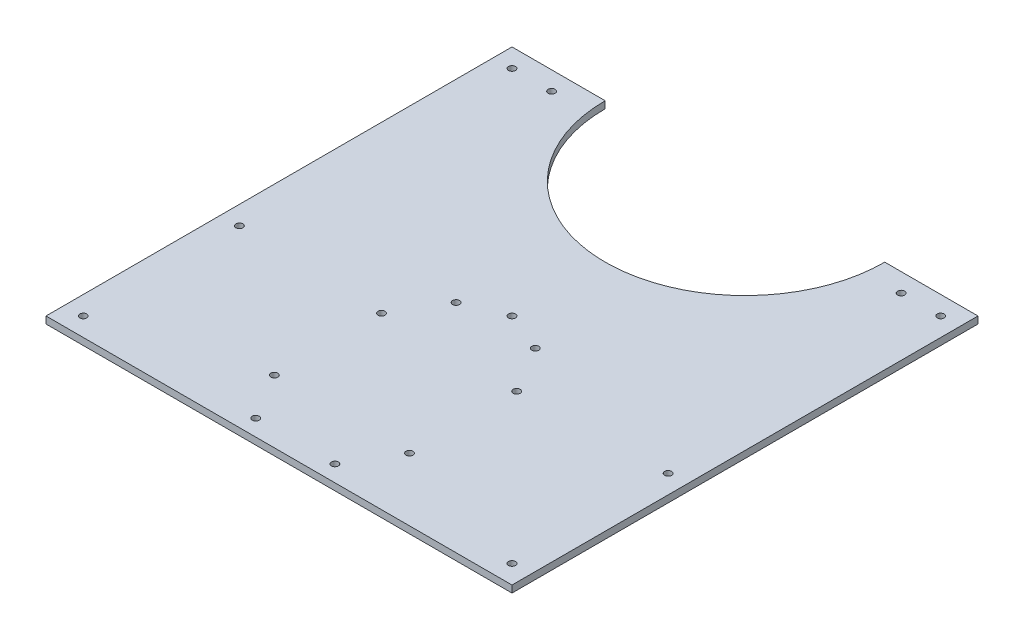
ISO-10303-21;
HEADER;
FILE_DESCRIPTION(('STEP AP214'),'2;1');
FILE_NAME('part.step','',(''),(''),'','','');
FILE_SCHEMA(('AUTOMOTIVE_DESIGN { 1 0 10303 214 1 1 1 1 }'));
ENDSEC;
DATA;
#1=APPLICATION_CONTEXT('core data for automotive mechanical design processes');
#2=APPLICATION_PROTOCOL_DEFINITION('international standard','automotive_design',2000,#1);
#3=PRODUCT_CONTEXT('',#1,'mechanical');
#4=PRODUCT('Part','Part','',(#3));
#5=PRODUCT_RELATED_PRODUCT_CATEGORY('part','',(#4));
#6=PRODUCT_DEFINITION_FORMATION('','',#4);
#7=PRODUCT_DEFINITION_CONTEXT('part definition',#1,'design');
#8=PRODUCT_DEFINITION('design','',#6,#7);
#9=PRODUCT_DEFINITION_SHAPE('','',#8);
#10=(LENGTH_UNIT() NAMED_UNIT(*) SI_UNIT(.MILLI.,.METRE.));
#11=(NAMED_UNIT(*) PLANE_ANGLE_UNIT() SI_UNIT($,.RADIAN.));
#12=(NAMED_UNIT(*) SI_UNIT($,.STERADIAN.) SOLID_ANGLE_UNIT());
#13=UNCERTAINTY_MEASURE_WITH_UNIT(LENGTH_MEASURE(1.E-05),#10,'distance_accuracy_value','');
#14=(GEOMETRIC_REPRESENTATION_CONTEXT(3) GLOBAL_UNCERTAINTY_ASSIGNED_CONTEXT((#13)) GLOBAL_UNIT_ASSIGNED_CONTEXT((#10,
#11,#12)) REPRESENTATION_CONTEXT('',''));
#15=CARTESIAN_POINT('',(0.,0.,0.));
#16=DIRECTION('',(0.,0.,1.));
#17=DIRECTION('',(1.,0.,0.));
#18=AXIS2_PLACEMENT_3D('',#15,#16,#17);
#19=CARTESIAN_POINT('',(-100.,3.,-100.));
#20=DIRECTION('',(0.,0.,1.));
#21=DIRECTION('',(1.,0.,0.));
#22=AXIS2_PLACEMENT_3D('',#19,#20,#21);
#23=PLANE('',#22);
#24=DIRECTION('',(-1.,0.,0.));
#25=VECTOR('',#24,1.);
#26=CARTESIAN_POINT('',(-100.,0.,-100.));
#27=LINE('',#26,#25);
#28=CARTESIAN_POINT('',(100.,0.,-100.));
#29=VERTEX_POINT('',#28);
#30=CARTESIAN_POINT('',(60.,0.,-100.));
#31=VERTEX_POINT('',#30);
#32=EDGE_CURVE('E108',#29,#31,#27,.T.);
#33=ORIENTED_EDGE('',*,*,#32,.T.);
#34=DIRECTION('',(0.,1.,0.));
#35=VECTOR('',#34,1.);
#36=CARTESIAN_POINT('',(60.,-2.,-100.));
#37=LINE('',#36,#35);
#38=CARTESIAN_POINT('',(60.,3.,-100.));
#39=VERTEX_POINT('',#38);
#40=EDGE_CURVE('E50',#31,#39,#37,.T.);
#41=ORIENTED_EDGE('',*,*,#40,.T.);
#42=DIRECTION('',(-1.,0.,0.));
#43=VECTOR('',#42,1.);
#44=CARTESIAN_POINT('',(-100.,3.,-100.));
#45=LINE('',#44,#43);
#46=CARTESIAN_POINT('',(100.,3.,-100.));
#47=VERTEX_POINT('',#46);
#48=EDGE_CURVE('E106',#47,#39,#45,.T.);
#49=ORIENTED_EDGE('',*,*,#48,.F.);
#50=DIRECTION('',(0.,-1.,0.));
#51=VECTOR('',#50,1.);
#52=CARTESIAN_POINT('',(100.,3.,-100.));
#53=LINE('',#52,#51);
#54=EDGE_CURVE('E118',#47,#29,#53,.T.);
#55=ORIENTED_EDGE('',*,*,#54,.T.);
#56=EDGE_LOOP('',(#33,#41,#49,#55));
#57=FACE_BOUND('',#56,.T.);
#58=ADVANCED_FACE('F33',(#57),#23,.F.);
#59=CARTESIAN_POINT('',(-100.,3.,-100.));
#60=DIRECTION('',(1.,0.,0.));
#61=DIRECTION('',(0.,0.,-1.));
#62=AXIS2_PLACEMENT_3D('',#59,#60,#61);
#63=PLANE('',#62);
#64=DIRECTION('',(0.,0.,1.));
#65=VECTOR('',#64,1.);
#66=CARTESIAN_POINT('',(-100.,0.,-100.));
#67=LINE('',#66,#65);
#68=CARTESIAN_POINT('',(-100.,0.,-100.));
#69=VERTEX_POINT('',#68);
#70=CARTESIAN_POINT('',(-100.,0.,100.));
#71=VERTEX_POINT('',#70);
#72=EDGE_CURVE('E123',#69,#71,#67,.T.);
#73=ORIENTED_EDGE('',*,*,#72,.T.);
#74=DIRECTION('',(0.,-1.,0.));
#75=VECTOR('',#74,1.);
#76=CARTESIAN_POINT('',(-100.,3.,100.));
#77=LINE('',#76,#75);
#78=CARTESIAN_POINT('',(-100.,3.,100.));
#79=VERTEX_POINT('',#78);
#80=EDGE_CURVE('E42',#79,#71,#77,.T.);
#81=ORIENTED_EDGE('',*,*,#80,.F.);
#82=DIRECTION('',(0.,0.,1.));
#83=VECTOR('',#82,1.);
#84=CARTESIAN_POINT('',(-100.,3.,-100.));
#85=LINE('',#84,#83);
#86=CARTESIAN_POINT('',(-100.,3.,-100.));
#87=VERTEX_POINT('',#86);
#88=EDGE_CURVE('E130',#87,#79,#85,.T.);
#89=ORIENTED_EDGE('',*,*,#88,.F.);
#90=DIRECTION('',(0.,-1.,0.));
#91=VECTOR('',#90,1.);
#92=CARTESIAN_POINT('',(-100.,3.,-100.));
#93=LINE('',#92,#91);
#94=EDGE_CURVE('E116',#87,#69,#93,.T.);
#95=ORIENTED_EDGE('',*,*,#94,.T.);
#96=EDGE_LOOP('',(#73,#81,#89,#95));
#97=FACE_BOUND('',#96,.T.);
#98=ADVANCED_FACE('F35',(#97),#63,.F.);
#99=CARTESIAN_POINT('',(-100.,3.,100.));
#100=DIRECTION('',(0.,0.,-1.));
#101=DIRECTION('',(-1.,0.,0.));
#102=AXIS2_PLACEMENT_3D('',#99,#100,#101);
#103=PLANE('',#102);
#104=DIRECTION('',(1.,0.,0.));
#105=VECTOR('',#104,1.);
#106=CARTESIAN_POINT('',(-100.,0.,100.));
#107=LINE('',#106,#105);
#108=CARTESIAN_POINT('',(100.,0.,100.));
#109=VERTEX_POINT('',#108);
#110=EDGE_CURVE('E126',#71,#109,#107,.T.);
#111=ORIENTED_EDGE('',*,*,#110,.T.);
#112=DIRECTION('',(0.,-1.,0.));
#113=VECTOR('',#112,1.);
#114=CARTESIAN_POINT('',(100.,3.,100.));
#115=LINE('',#114,#113);
#116=CARTESIAN_POINT('',(100.,3.,100.));
#117=VERTEX_POINT('',#116);
#118=EDGE_CURVE('E133',#117,#109,#115,.T.);
#119=ORIENTED_EDGE('',*,*,#118,.F.);
#120=DIRECTION('',(1.,0.,0.));
#121=VECTOR('',#120,1.);
#122=CARTESIAN_POINT('',(-100.,3.,100.));
#123=LINE('',#122,#121);
#124=EDGE_CURVE('E88',#79,#117,#123,.T.);
#125=ORIENTED_EDGE('',*,*,#124,.F.);
#126=ORIENTED_EDGE('',*,*,#80,.T.);
#127=EDGE_LOOP('',(#111,#119,#125,#126));
#128=FACE_BOUND('',#127,.T.);
#129=ADVANCED_FACE('F209',(#128),#103,.F.);
#130=CARTESIAN_POINT('',(100.,3.,-100.));
#131=DIRECTION('',(-1.,0.,0.));
#132=DIRECTION('',(0.,0.,1.));
#133=AXIS2_PLACEMENT_3D('',#130,#131,#132);
#134=PLANE('',#133);
#135=DIRECTION('',(0.,0.,-1.));
#136=VECTOR('',#135,1.);
#137=CARTESIAN_POINT('',(100.,0.,-100.));
#138=LINE('',#137,#136);
#139=EDGE_CURVE('E128',#109,#29,#138,.T.);
#140=ORIENTED_EDGE('',*,*,#139,.T.);
#141=ORIENTED_EDGE('',*,*,#54,.F.);
#142=DIRECTION('',(0.,0.,-1.));
#143=VECTOR('',#142,1.);
#144=CARTESIAN_POINT('',(100.,3.,-100.));
#145=LINE('',#144,#143);
#146=EDGE_CURVE('E114',#117,#47,#145,.T.);
#147=ORIENTED_EDGE('',*,*,#146,.F.);
#148=ORIENTED_EDGE('',*,*,#118,.T.);
#149=EDGE_LOOP('',(#140,#141,#147,#148));
#150=FACE_BOUND('',#149,.T.);
#151=ADVANCED_FACE('F214',(#150),#134,.F.);
#152=CARTESIAN_POINT('',(-60.,3.,-100.));
#153=VERTEX_POINT('',#152);
#154=EDGE_CURVE('E58',#153,#87,#45,.T.);
#155=ORIENTED_EDGE('',*,*,#154,.F.);
#156=DIRECTION('',(0.,1.,0.));
#157=VECTOR('',#156,1.);
#158=CARTESIAN_POINT('',(-60.,-2.,-100.));
#159=LINE('',#158,#157);
#160=CARTESIAN_POINT('',(-60.,0.,-100.));
#161=VERTEX_POINT('',#160);
#162=EDGE_CURVE('E97',#153,#161,#159,.F.);
#163=ORIENTED_EDGE('',*,*,#162,.T.);
#164=EDGE_CURVE('E80',#161,#69,#27,.T.);
#165=ORIENTED_EDGE('',*,*,#164,.T.);
#166=ORIENTED_EDGE('',*,*,#94,.F.);
#167=EDGE_LOOP('',(#155,#163,#165,#166));
#168=FACE_BOUND('',#167,.T.);
#169=ADVANCED_FACE('F205',(#168),#23,.F.);
#170=CARTESIAN_POINT('',(0.,3.,0.));
#171=DIRECTION('',(0.,1.,0.));
#172=DIRECTION('',(0.,0.,1.));
#173=AXIS2_PLACEMENT_3D('',#170,#171,#172);
#174=PLANE('',#173);
#175=CARTESIAN_POINT('',(29.,3.,27.));
#176=DIRECTION('',(0.,1.,0.));
#177=DIRECTION('',(0.,0.,-1.));
#178=AXIS2_PLACEMENT_3D('',#175,#176,#177);
#179=CIRCLE('',#178,1.50000000000001);
#180=CARTESIAN_POINT('',(29.,3.,25.5));
#181=VERTEX_POINT('',#180);
#182=EDGE_CURVE('E247',#181,#181,#179,.T.);
#183=ORIENTED_EDGE('',*,*,#182,.F.);
#184=EDGE_LOOP('',(#183));
#185=FACE_BOUND('',#184,.T.);
#186=CARTESIAN_POINT('',(17.,3.,6.99999999999999));
#187=DIRECTION('',(0.,1.,0.));
#188=DIRECTION('',(0.,0.,-1.));
#189=AXIS2_PLACEMENT_3D('',#186,#187,#188);
#190=CIRCLE('',#189,1.5);
#191=CARTESIAN_POINT('',(17.,3.,5.49999999999999));
#192=VERTEX_POINT('',#191);
#193=EDGE_CURVE('E262',#192,#192,#190,.T.);
#194=ORIENTED_EDGE('',*,*,#193,.F.);
#195=EDGE_LOOP('',(#194));
#196=FACE_BOUND('',#195,.T.);
#197=CARTESIAN_POINT('',(-92.0000000000001,3.,25.));
#198=DIRECTION('',(0.,1.,0.));
#199=DIRECTION('',(0.,0.,-1.));
#200=AXIS2_PLACEMENT_3D('',#197,#198,#199);
#201=CIRCLE('',#200,1.50000000000001);
#202=CARTESIAN_POINT('',(-92.0000000000001,3.,23.5));
#203=VERTEX_POINT('',#202);
#204=EDGE_CURVE('E258',#203,#203,#201,.T.);
#205=ORIENTED_EDGE('',*,*,#204,.F.);
#206=EDGE_LOOP('',(#205));
#207=FACE_BOUND('',#206,.T.);
#208=CARTESIAN_POINT('',(-17.0000000000001,3.,93.));
#209=DIRECTION('',(0.,1.,0.));
#210=DIRECTION('',(0.,0.,-1.));
#211=AXIS2_PLACEMENT_3D('',#208,#209,#210);
#212=CIRCLE('',#211,1.5);
#213=CARTESIAN_POINT('',(-17.0000000000001,3.,91.5));
#214=VERTEX_POINT('',#213);
#215=EDGE_CURVE('E255',#214,#214,#212,.T.);
#216=ORIENTED_EDGE('',*,*,#215,.F.);
#217=EDGE_LOOP('',(#216));
#218=FACE_BOUND('',#217,.T.);
#219=CARTESIAN_POINT('',(-29.0000000000001,3.,73.));
#220=DIRECTION('',(0.,1.,0.));
#221=DIRECTION('',(0.,0.,-1.));
#222=AXIS2_PLACEMENT_3D('',#219,#220,#221);
#223=CIRCLE('',#222,1.50000000000001);
#224=CARTESIAN_POINT('',(-29.0000000000001,3.,71.5));
#225=VERTEX_POINT('',#224);
#226=EDGE_CURVE('E259',#225,#225,#223,.T.);
#227=ORIENTED_EDGE('',*,*,#226,.F.);
#228=EDGE_LOOP('',(#227));
#229=FACE_BOUND('',#228,.T.);
#230=CARTESIAN_POINT('',(-29.0000000000001,3.,27.));
#231=DIRECTION('',(0.,1.,0.));
#232=DIRECTION('',(0.,0.,1.));
#233=AXIS2_PLACEMENT_3D('',#230,#231,#232);
#234=CIRCLE('',#233,1.50000000000001);
#235=CARTESIAN_POINT('',(-29.0000000000001,3.,28.5));
#236=VERTEX_POINT('',#235);
#237=EDGE_CURVE('E268',#236,#236,#234,.T.);
#238=ORIENTED_EDGE('',*,*,#237,.F.);
#239=EDGE_LOOP('',(#238));
#240=FACE_BOUND('',#239,.T.);
#241=CARTESIAN_POINT('',(-17.0000000000001,3.,6.99999999999999));
#242=DIRECTION('',(0.,1.,0.));
#243=DIRECTION('',(0.,0.,1.));
#244=AXIS2_PLACEMENT_3D('',#241,#242,#243);
#245=CIRCLE('',#244,1.5);
#246=CARTESIAN_POINT('',(-17.0000000000001,3.,8.49999999999999));
#247=VERTEX_POINT('',#246);
#248=EDGE_CURVE('E99',#247,#247,#245,.T.);
#249=ORIENTED_EDGE('',*,*,#248,.F.);
#250=EDGE_LOOP('',(#249));
#251=FACE_BOUND('',#250,.T.);
#252=CARTESIAN_POINT('',(0.,3.,-100.));
#253=DIRECTION('',(0.,1.,0.));
#254=DIRECTION('',(0.,0.,1.));
#255=AXIS2_PLACEMENT_3D('',#252,#253,#254);
#256=CIRCLE('',#255,60.);
#257=EDGE_CURVE('E95',#153,#39,#256,.T.);
#258=ORIENTED_EDGE('',*,*,#257,.F.);
#259=ORIENTED_EDGE('',*,*,#154,.T.);
#260=ORIENTED_EDGE('',*,*,#88,.T.);
#261=ORIENTED_EDGE('',*,*,#124,.T.);
#262=ORIENTED_EDGE('',*,*,#146,.T.);
#263=ORIENTED_EDGE('',*,*,#48,.T.);
#264=EDGE_LOOP('',(#258,#259,#260,#261,#262,#263));
#265=FACE_BOUND('',#264,.T.);
#266=CARTESIAN_POINT('',(92.,3.,25.));
#267=DIRECTION('',(0.,1.,0.));
#268=DIRECTION('',(0.,0.,1.));
#269=AXIS2_PLACEMENT_3D('',#266,#267,#268);
#270=CIRCLE('',#269,1.50000000000001);
#271=CARTESIAN_POINT('',(92.,3.,26.5));
#272=VERTEX_POINT('',#271);
#273=EDGE_CURVE('E230',#272,#272,#270,.T.);
#274=ORIENTED_EDGE('',*,*,#273,.F.);
#275=EDGE_LOOP('',(#274));
#276=FACE_BOUND('',#275,.T.);
#277=CARTESIAN_POINT('',(92.000000000005,3.,92.));
#278=DIRECTION('',(0.,1.,0.));
#279=DIRECTION('',(0.,0.,1.));
#280=AXIS2_PLACEMENT_3D('',#277,#278,#279);
#281=CIRCLE('',#280,1.49999999999874);
#282=CARTESIAN_POINT('',(92.000000000005,3.,93.4999999999987));
#283=VERTEX_POINT('',#282);
#284=EDGE_CURVE('E238',#283,#283,#281,.T.);
#285=ORIENTED_EDGE('',*,*,#284,.F.);
#286=EDGE_LOOP('',(#285));
#287=FACE_BOUND('',#286,.T.);
#288=CARTESIAN_POINT('',(-91.9999999999949,3.,92.000000000005));
#289=DIRECTION('',(0.,1.,0.));
#290=DIRECTION('',(0.,0.,1.));
#291=AXIS2_PLACEMENT_3D('',#288,#289,#290);
#292=CIRCLE('',#291,1.50000000000378);
#293=CARTESIAN_POINT('',(-91.9999999999949,3.,93.5000000000088));
#294=VERTEX_POINT('',#293);
#295=EDGE_CURVE('E234',#294,#294,#292,.T.);
#296=ORIENTED_EDGE('',*,*,#295,.F.);
#297=EDGE_LOOP('',(#296));
#298=FACE_BOUND('',#297,.T.);
#299=CARTESIAN_POINT('',(-92.,3.,-91.9999999999949));
#300=DIRECTION('',(0.,1.,0.));
#301=DIRECTION('',(0.,0.,1.));
#302=AXIS2_PLACEMENT_3D('',#299,#300,#301);
#303=CIRCLE('',#302,1.50000000000546);
#304=CARTESIAN_POINT('',(-92.,3.,-90.4999999999895));
#305=VERTEX_POINT('',#304);
#306=EDGE_CURVE('E231',#305,#305,#303,.T.);
#307=ORIENTED_EDGE('',*,*,#306,.F.);
#308=EDGE_LOOP('',(#307));
#309=FACE_BOUND('',#308,.T.);
#310=CARTESIAN_POINT('',(17.,3.,93.));
#311=DIRECTION('',(0.,1.,0.));
#312=DIRECTION('',(0.,0.,1.));
#313=AXIS2_PLACEMENT_3D('',#310,#311,#312);
#314=CIRCLE('',#313,1.5);
#315=CARTESIAN_POINT('',(17.,3.,94.5));
#316=VERTEX_POINT('',#315);
#317=EDGE_CURVE('E235',#316,#316,#314,.T.);
#318=ORIENTED_EDGE('',*,*,#317,.F.);
#319=EDGE_LOOP('',(#318));
#320=FACE_BOUND('',#319,.T.);
#321=CARTESIAN_POINT('',(29.,3.,73.));
#322=DIRECTION('',(0.,1.,0.));
#323=DIRECTION('',(0.,0.,1.));
#324=AXIS2_PLACEMENT_3D('',#321,#322,#323);
#325=CIRCLE('',#324,1.50000000000001);
#326=CARTESIAN_POINT('',(29.,3.,74.5));
#327=VERTEX_POINT('',#326);
#328=EDGE_CURVE('E250',#327,#327,#325,.T.);
#329=ORIENTED_EDGE('',*,*,#328,.F.);
#330=EDGE_LOOP('',(#329));
#331=FACE_BOUND('',#330,.T.);
#332=CARTESIAN_POINT('',(75.,3.,-92.));
#333=DIRECTION('',(0.,1.,0.));
#334=DIRECTION('',(0.,0.,1.));
#335=AXIS2_PLACEMENT_3D('',#332,#333,#334);
#336=CIRCLE('',#335,1.50000000000001);
#337=CARTESIAN_POINT('',(75.,3.,-90.5));
#338=VERTEX_POINT('',#337);
#339=EDGE_CURVE('E246',#338,#338,#336,.T.);
#340=ORIENTED_EDGE('',*,*,#339,.F.);
#341=EDGE_LOOP('',(#340));
#342=FACE_BOUND('',#341,.T.);
#343=CARTESIAN_POINT('',(0.,3.,0.));
#344=DIRECTION('',(0.,1.,0.));
#345=DIRECTION('',(0.,0.,1.));
#346=AXIS2_PLACEMENT_3D('',#343,#344,#345);
#347=CIRCLE('',#346,1.5);
#348=CARTESIAN_POINT('',(0.,3.,1.50000000000001));
#349=VERTEX_POINT('',#348);
#350=EDGE_CURVE('E243',#349,#349,#347,.T.);
#351=ORIENTED_EDGE('',*,*,#350,.F.);
#352=EDGE_LOOP('',(#351));
#353=FACE_BOUND('',#352,.T.);
#354=CARTESIAN_POINT('',(-75.0000000000001,3.,-92.));
#355=DIRECTION('',(0.,1.,0.));
#356=DIRECTION('',(0.,0.,-1.));
#357=AXIS2_PLACEMENT_3D('',#354,#355,#356);
#358=CIRCLE('',#357,1.50000000000001);
#359=CARTESIAN_POINT('',(-75.0000000000001,3.,-93.5));
#360=VERTEX_POINT('',#359);
#361=EDGE_CURVE('E100',#360,#360,#358,.T.);
#362=ORIENTED_EDGE('',*,*,#361,.F.);
#363=EDGE_LOOP('',(#362));
#364=FACE_BOUND('',#363,.T.);
#365=CARTESIAN_POINT('',(92.,3.,-92.));
#366=DIRECTION('',(0.,1.,0.));
#367=DIRECTION('',(0.,0.,1.));
#368=AXIS2_PLACEMENT_3D('',#365,#366,#367);
#369=CIRCLE('',#368,1.5);
#370=CARTESIAN_POINT('',(92.,3.,-90.5));
#371=VERTEX_POINT('',#370);
#372=EDGE_CURVE('E141',#371,#371,#369,.T.);
#373=ORIENTED_EDGE('',*,*,#372,.F.);
#374=EDGE_LOOP('',(#373));
#375=FACE_BOUND('',#374,.T.);
#376=ADVANCED_FACE('F111',(#185,#196,#207,#218,#229,#240,#251,#265,#276,#287,#298,#309,#320,
#331,#342,#353,#364,#375),#174,.T.);
#377=CARTESIAN_POINT('',(0.,0.,0.));
#378=DIRECTION('',(0.,1.,0.));
#379=DIRECTION('',(0.,0.,1.));
#380=AXIS2_PLACEMENT_3D('',#377,#378,#379);
#381=PLANE('',#380);
#382=CARTESIAN_POINT('',(29.,0.,27.));
#383=DIRECTION('',(0.,1.,0.));
#384=DIRECTION('',(0.,0.,1.));
#385=AXIS2_PLACEMENT_3D('',#382,#383,#384);
#386=CIRCLE('',#385,1.50000000000001);
#387=CARTESIAN_POINT('',(29.,0.,28.5));
#388=VERTEX_POINT('',#387);
#389=EDGE_CURVE('E37',#388,#388,#386,.T.);
#390=ORIENTED_EDGE('',*,*,#389,.T.);
#391=EDGE_LOOP('',(#390));
#392=FACE_BOUND('',#391,.T.);
#393=CARTESIAN_POINT('',(17.,0.,6.99999999999999));
#394=DIRECTION('',(0.,1.,0.));
#395=DIRECTION('',(0.,0.,1.));
#396=AXIS2_PLACEMENT_3D('',#393,#394,#395);
#397=CIRCLE('',#396,1.5);
#398=CARTESIAN_POINT('',(17.,0.,8.49999999999999));
#399=VERTEX_POINT('',#398);
#400=EDGE_CURVE('E181',#399,#399,#397,.T.);
#401=ORIENTED_EDGE('',*,*,#400,.T.);
#402=EDGE_LOOP('',(#401));
#403=FACE_BOUND('',#402,.T.);
#404=CARTESIAN_POINT('',(-92.0000000000001,0.,25.));
#405=DIRECTION('',(0.,1.,0.));
#406=DIRECTION('',(0.,0.,1.));
#407=AXIS2_PLACEMENT_3D('',#404,#405,#406);
#408=CIRCLE('',#407,1.50000000000001);
#409=CARTESIAN_POINT('',(-92.0000000000001,0.,26.5));
#410=VERTEX_POINT('',#409);
#411=EDGE_CURVE('E179',#410,#410,#408,.T.);
#412=ORIENTED_EDGE('',*,*,#411,.T.);
#413=EDGE_LOOP('',(#412));
#414=FACE_BOUND('',#413,.T.);
#415=CARTESIAN_POINT('',(-17.0000000000001,0.,93.));
#416=DIRECTION('',(0.,1.,0.));
#417=DIRECTION('',(0.,0.,1.));
#418=AXIS2_PLACEMENT_3D('',#415,#416,#417);
#419=CIRCLE('',#418,1.5);
#420=CARTESIAN_POINT('',(-17.0000000000001,0.,94.5));
#421=VERTEX_POINT('',#420);
#422=EDGE_CURVE('E176',#421,#421,#419,.T.);
#423=ORIENTED_EDGE('',*,*,#422,.T.);
#424=EDGE_LOOP('',(#423));
#425=FACE_BOUND('',#424,.T.);
#426=CARTESIAN_POINT('',(-29.0000000000001,0.,73.));
#427=DIRECTION('',(0.,1.,0.));
#428=DIRECTION('',(0.,0.,1.));
#429=AXIS2_PLACEMENT_3D('',#426,#427,#428);
#430=CIRCLE('',#429,1.50000000000001);
#431=CARTESIAN_POINT('',(-29.0000000000001,0.,74.5));
#432=VERTEX_POINT('',#431);
#433=EDGE_CURVE('E173',#432,#432,#430,.T.);
#434=ORIENTED_EDGE('',*,*,#433,.T.);
#435=EDGE_LOOP('',(#434));
#436=FACE_BOUND('',#435,.T.);
#437=CARTESIAN_POINT('',(-29.0000000000001,0.,27.));
#438=DIRECTION('',(0.,1.,0.));
#439=DIRECTION('',(0.,0.,1.));
#440=AXIS2_PLACEMENT_3D('',#437,#438,#439);
#441=CIRCLE('',#440,1.50000000000001);
#442=CARTESIAN_POINT('',(-29.0000000000001,0.,28.5));
#443=VERTEX_POINT('',#442);
#444=EDGE_CURVE('E170',#443,#443,#441,.T.);
#445=ORIENTED_EDGE('',*,*,#444,.T.);
#446=EDGE_LOOP('',(#445));
#447=FACE_BOUND('',#446,.T.);
#448=CARTESIAN_POINT('',(-17.0000000000001,0.,6.99999999999999));
#449=DIRECTION('',(0.,1.,0.));
#450=DIRECTION('',(0.,0.,1.));
#451=AXIS2_PLACEMENT_3D('',#448,#449,#450);
#452=CIRCLE('',#451,1.5);
#453=CARTESIAN_POINT('',(-17.0000000000001,0.,8.49999999999999));
#454=VERTEX_POINT('',#453);
#455=EDGE_CURVE('E109',#454,#454,#452,.T.);
#456=ORIENTED_EDGE('',*,*,#455,.T.);
#457=EDGE_LOOP('',(#456));
#458=FACE_BOUND('',#457,.T.);
#459=CARTESIAN_POINT('',(92.,0.,25.));
#460=DIRECTION('',(0.,1.,0.));
#461=DIRECTION('',(0.,0.,1.));
#462=AXIS2_PLACEMENT_3D('',#459,#460,#461);
#463=CIRCLE('',#462,1.50000000000001);
#464=CARTESIAN_POINT('',(92.,0.,26.5));
#465=VERTEX_POINT('',#464);
#466=EDGE_CURVE('E165',#465,#465,#463,.T.);
#467=ORIENTED_EDGE('',*,*,#466,.T.);
#468=EDGE_LOOP('',(#467));
#469=FACE_BOUND('',#468,.T.);
#470=CARTESIAN_POINT('',(92.000000000005,0.,92.));
#471=DIRECTION('',(0.,1.,0.));
#472=DIRECTION('',(0.,0.,1.));
#473=AXIS2_PLACEMENT_3D('',#470,#471,#472);
#474=CIRCLE('',#473,1.49999999999874);
#475=CARTESIAN_POINT('',(92.000000000005,0.,93.4999999999987));
#476=VERTEX_POINT('',#475);
#477=EDGE_CURVE('E162',#476,#476,#474,.T.);
#478=ORIENTED_EDGE('',*,*,#477,.T.);
#479=EDGE_LOOP('',(#478));
#480=FACE_BOUND('',#479,.T.);
#481=CARTESIAN_POINT('',(-91.9999999999949,0.,92.000000000005));
#482=DIRECTION('',(0.,1.,0.));
#483=DIRECTION('',(0.,0.,1.));
#484=AXIS2_PLACEMENT_3D('',#481,#482,#483);
#485=CIRCLE('',#484,1.50000000000378);
#486=CARTESIAN_POINT('',(-91.9999999999949,0.,93.5000000000088));
#487=VERTEX_POINT('',#486);
#488=EDGE_CURVE('E159',#487,#487,#485,.T.);
#489=ORIENTED_EDGE('',*,*,#488,.T.);
#490=EDGE_LOOP('',(#489));
#491=FACE_BOUND('',#490,.T.);
#492=CARTESIAN_POINT('',(-92.,0.,-91.9999999999949));
#493=DIRECTION('',(0.,1.,0.));
#494=DIRECTION('',(0.,0.,1.));
#495=AXIS2_PLACEMENT_3D('',#492,#493,#494);
#496=CIRCLE('',#495,1.50000000000546);
#497=CARTESIAN_POINT('',(-92.,0.,-90.4999999999895));
#498=VERTEX_POINT('',#497);
#499=EDGE_CURVE('E156',#498,#498,#496,.T.);
#500=ORIENTED_EDGE('',*,*,#499,.T.);
#501=EDGE_LOOP('',(#500));
#502=FACE_BOUND('',#501,.T.);
#503=CARTESIAN_POINT('',(17.,0.,93.));
#504=DIRECTION('',(0.,1.,0.));
#505=DIRECTION('',(0.,0.,1.));
#506=AXIS2_PLACEMENT_3D('',#503,#504,#505);
#507=CIRCLE('',#506,1.5);
#508=CARTESIAN_POINT('',(17.,0.,94.5));
#509=VERTEX_POINT('',#508);
#510=EDGE_CURVE('E153',#509,#509,#507,.T.);
#511=ORIENTED_EDGE('',*,*,#510,.T.);
#512=EDGE_LOOP('',(#511));
#513=FACE_BOUND('',#512,.T.);
#514=CARTESIAN_POINT('',(29.,0.,73.));
#515=DIRECTION('',(0.,1.,0.));
#516=DIRECTION('',(0.,0.,1.));
#517=AXIS2_PLACEMENT_3D('',#514,#515,#516);
#518=CIRCLE('',#517,1.50000000000001);
#519=CARTESIAN_POINT('',(29.,0.,74.5));
#520=VERTEX_POINT('',#519);
#521=EDGE_CURVE('E150',#520,#520,#518,.T.);
#522=ORIENTED_EDGE('',*,*,#521,.T.);
#523=EDGE_LOOP('',(#522));
#524=FACE_BOUND('',#523,.T.);
#525=CARTESIAN_POINT('',(75.,0.,-92.));
#526=DIRECTION('',(0.,1.,0.));
#527=DIRECTION('',(0.,0.,1.));
#528=AXIS2_PLACEMENT_3D('',#525,#526,#527);
#529=CIRCLE('',#528,1.50000000000001);
#530=CARTESIAN_POINT('',(75.,0.,-90.5));
#531=VERTEX_POINT('',#530);
#532=EDGE_CURVE('E147',#531,#531,#529,.T.);
#533=ORIENTED_EDGE('',*,*,#532,.T.);
#534=EDGE_LOOP('',(#533));
#535=FACE_BOUND('',#534,.T.);
#536=CARTESIAN_POINT('',(0.,0.,0.));
#537=DIRECTION('',(0.,1.,0.));
#538=DIRECTION('',(0.,0.,1.));
#539=AXIS2_PLACEMENT_3D('',#536,#537,#538);
#540=CIRCLE('',#539,1.5);
#541=CARTESIAN_POINT('',(0.,0.,1.50000000000001));
#542=VERTEX_POINT('',#541);
#543=EDGE_CURVE('E144',#542,#542,#540,.T.);
#544=ORIENTED_EDGE('',*,*,#543,.T.);
#545=EDGE_LOOP('',(#544));
#546=FACE_BOUND('',#545,.T.);
#547=CARTESIAN_POINT('',(-75.0000000000001,0.,-92.));
#548=DIRECTION('',(0.,1.,0.));
#549=DIRECTION('',(0.,0.,1.));
#550=AXIS2_PLACEMENT_3D('',#547,#548,#549);
#551=CIRCLE('',#550,1.50000000000001);
#552=CARTESIAN_POINT('',(-75.0000000000001,0.,-90.5));
#553=VERTEX_POINT('',#552);
#554=EDGE_CURVE('E140',#553,#553,#551,.T.);
#555=ORIENTED_EDGE('',*,*,#554,.T.);
#556=EDGE_LOOP('',(#555));
#557=FACE_BOUND('',#556,.T.);
#558=CARTESIAN_POINT('',(92.,0.,-92.));
#559=DIRECTION('',(0.,1.,0.));
#560=DIRECTION('',(0.,0.,1.));
#561=AXIS2_PLACEMENT_3D('',#558,#559,#560);
#562=CIRCLE('',#561,1.5);
#563=CARTESIAN_POINT('',(92.,0.,-90.5));
#564=VERTEX_POINT('',#563);
#565=EDGE_CURVE('E137',#564,#564,#562,.T.);
#566=ORIENTED_EDGE('',*,*,#565,.T.);
#567=EDGE_LOOP('',(#566));
#568=FACE_BOUND('',#567,.T.);
#569=ORIENTED_EDGE('',*,*,#164,.F.);
#570=CARTESIAN_POINT('',(0.,0.,-100.));
#571=DIRECTION('',(0.,1.,0.));
#572=DIRECTION('',(0.,0.,1.));
#573=AXIS2_PLACEMENT_3D('',#570,#571,#572);
#574=CIRCLE('',#573,60.);
#575=EDGE_CURVE('E11',#161,#31,#574,.T.);
#576=ORIENTED_EDGE('',*,*,#575,.T.);
#577=ORIENTED_EDGE('',*,*,#32,.F.);
#578=ORIENTED_EDGE('',*,*,#139,.F.);
#579=ORIENTED_EDGE('',*,*,#110,.F.);
#580=ORIENTED_EDGE('',*,*,#72,.F.);
#581=EDGE_LOOP('',(#569,#576,#577,#578,#579,#580));
#582=FACE_BOUND('',#581,.T.);
#583=ADVANCED_FACE('F188',(#392,#403,#414,#425,#436,#447,#458,#469,#480,#491,#502,#513,#524,
#535,#546,#557,#568,#582),#381,.F.);
#584=CARTESIAN_POINT('',(92.,-2.,-92.));
#585=DIRECTION('',(0.,1.,0.));
#586=DIRECTION('',(0.,0.,1.));
#587=AXIS2_PLACEMENT_3D('',#584,#585,#586);
#588=CYLINDRICAL_SURFACE('',#587,1.5);
#589=ORIENTED_EDGE('',*,*,#372,.T.);
#590=EDGE_LOOP('',(#589));
#591=FACE_BOUND('',#590,.T.);
#592=ORIENTED_EDGE('',*,*,#565,.F.);
#593=EDGE_LOOP('',(#592));
#594=FACE_BOUND('',#593,.T.);
#595=ADVANCED_FACE('F282',(#591,#594),#588,.F.);
#596=CARTESIAN_POINT('',(-75.0000000000001,-2.,-92.));
#597=DIRECTION('',(0.,1.,0.));
#598=DIRECTION('',(0.,0.,1.));
#599=AXIS2_PLACEMENT_3D('',#596,#597,#598);
#600=CYLINDRICAL_SURFACE('',#599,1.50000000000001);
#601=ORIENTED_EDGE('',*,*,#361,.T.);
#602=EDGE_LOOP('',(#601));
#603=FACE_BOUND('',#602,.T.);
#604=ORIENTED_EDGE('',*,*,#554,.F.);
#605=EDGE_LOOP('',(#604));
#606=FACE_BOUND('',#605,.T.);
#607=ADVANCED_FACE('F276',(#603,#606),#600,.F.);
#608=CARTESIAN_POINT('',(0.,-2.,0.));
#609=DIRECTION('',(0.,1.,0.));
#610=DIRECTION('',(0.,0.,1.));
#611=AXIS2_PLACEMENT_3D('',#608,#609,#610);
#612=CYLINDRICAL_SURFACE('',#611,1.5);
#613=ORIENTED_EDGE('',*,*,#350,.T.);
#614=EDGE_LOOP('',(#613));
#615=FACE_BOUND('',#614,.T.);
#616=ORIENTED_EDGE('',*,*,#543,.F.);
#617=EDGE_LOOP('',(#616));
#618=FACE_BOUND('',#617,.T.);
#619=ADVANCED_FACE('F335',(#615,#618),#612,.F.);
#620=CARTESIAN_POINT('',(75.,-2.,-92.));
#621=DIRECTION('',(0.,1.,0.));
#622=DIRECTION('',(0.,0.,1.));
#623=AXIS2_PLACEMENT_3D('',#620,#621,#622);
#624=CYLINDRICAL_SURFACE('',#623,1.50000000000001);
#625=ORIENTED_EDGE('',*,*,#339,.T.);
#626=EDGE_LOOP('',(#625));
#627=FACE_BOUND('',#626,.T.);
#628=ORIENTED_EDGE('',*,*,#532,.F.);
#629=EDGE_LOOP('',(#628));
#630=FACE_BOUND('',#629,.T.);
#631=ADVANCED_FACE('F344',(#627,#630),#624,.F.);
#632=CARTESIAN_POINT('',(29.,-2.,73.));
#633=DIRECTION('',(0.,1.,0.));
#634=DIRECTION('',(0.,0.,1.));
#635=AXIS2_PLACEMENT_3D('',#632,#633,#634);
#636=CYLINDRICAL_SURFACE('',#635,1.50000000000001);
#637=ORIENTED_EDGE('',*,*,#328,.T.);
#638=EDGE_LOOP('',(#637));
#639=FACE_BOUND('',#638,.T.);
#640=ORIENTED_EDGE('',*,*,#521,.F.);
#641=EDGE_LOOP('',(#640));
#642=FACE_BOUND('',#641,.T.);
#643=ADVANCED_FACE('F354',(#639,#642),#636,.F.);
#644=CARTESIAN_POINT('',(17.,-2.,93.));
#645=DIRECTION('',(0.,1.,0.));
#646=DIRECTION('',(0.,0.,1.));
#647=AXIS2_PLACEMENT_3D('',#644,#645,#646);
#648=CYLINDRICAL_SURFACE('',#647,1.5);
#649=ORIENTED_EDGE('',*,*,#317,.T.);
#650=EDGE_LOOP('',(#649));
#651=FACE_BOUND('',#650,.T.);
#652=ORIENTED_EDGE('',*,*,#510,.F.);
#653=EDGE_LOOP('',(#652));
#654=FACE_BOUND('',#653,.T.);
#655=ADVANCED_FACE('F364',(#651,#654),#648,.F.);
#656=CARTESIAN_POINT('',(-92.,-2.,-91.9999999999949));
#657=DIRECTION('',(0.,1.,0.));
#658=DIRECTION('',(0.,0.,1.));
#659=AXIS2_PLACEMENT_3D('',#656,#657,#658);
#660=CYLINDRICAL_SURFACE('',#659,1.50000000000546);
#661=ORIENTED_EDGE('',*,*,#306,.T.);
#662=EDGE_LOOP('',(#661));
#663=FACE_BOUND('',#662,.T.);
#664=ORIENTED_EDGE('',*,*,#499,.F.);
#665=EDGE_LOOP('',(#664));
#666=FACE_BOUND('',#665,.T.);
#667=ADVANCED_FACE('F374',(#663,#666),#660,.F.);
#668=CARTESIAN_POINT('',(-91.9999999999949,-2.,92.000000000005));
#669=DIRECTION('',(0.,1.,0.));
#670=DIRECTION('',(0.,0.,1.));
#671=AXIS2_PLACEMENT_3D('',#668,#669,#670);
#672=CYLINDRICAL_SURFACE('',#671,1.50000000000378);
#673=ORIENTED_EDGE('',*,*,#295,.T.);
#674=EDGE_LOOP('',(#673));
#675=FACE_BOUND('',#674,.T.);
#676=ORIENTED_EDGE('',*,*,#488,.F.);
#677=EDGE_LOOP('',(#676));
#678=FACE_BOUND('',#677,.T.);
#679=ADVANCED_FACE('F384',(#675,#678),#672,.F.);
#680=CARTESIAN_POINT('',(92.000000000005,-2.,92.));
#681=DIRECTION('',(0.,1.,0.));
#682=DIRECTION('',(0.,0.,1.));
#683=AXIS2_PLACEMENT_3D('',#680,#681,#682);
#684=CYLINDRICAL_SURFACE('',#683,1.49999999999874);
#685=ORIENTED_EDGE('',*,*,#284,.T.);
#686=EDGE_LOOP('',(#685));
#687=FACE_BOUND('',#686,.T.);
#688=ORIENTED_EDGE('',*,*,#477,.F.);
#689=EDGE_LOOP('',(#688));
#690=FACE_BOUND('',#689,.T.);
#691=ADVANCED_FACE('F394',(#687,#690),#684,.F.);
#692=CARTESIAN_POINT('',(92.,-2.,25.));
#693=DIRECTION('',(0.,1.,0.));
#694=DIRECTION('',(0.,0.,1.));
#695=AXIS2_PLACEMENT_3D('',#692,#693,#694);
#696=CYLINDRICAL_SURFACE('',#695,1.50000000000001);
#697=ORIENTED_EDGE('',*,*,#273,.T.);
#698=EDGE_LOOP('',(#697));
#699=FACE_BOUND('',#698,.T.);
#700=ORIENTED_EDGE('',*,*,#466,.F.);
#701=EDGE_LOOP('',(#700));
#702=FACE_BOUND('',#701,.T.);
#703=ADVANCED_FACE('F404',(#699,#702),#696,.F.);
#704=CARTESIAN_POINT('',(0.,-2.,-100.));
#705=DIRECTION('',(0.,1.,0.));
#706=DIRECTION('',(0.,0.,1.));
#707=AXIS2_PLACEMENT_3D('',#704,#705,#706);
#708=CYLINDRICAL_SURFACE('',#707,60.);
#709=ORIENTED_EDGE('',*,*,#575,.F.);
#710=ORIENTED_EDGE('',*,*,#162,.F.);
#711=ORIENTED_EDGE('',*,*,#257,.T.);
#712=ORIENTED_EDGE('',*,*,#40,.F.);
#713=EDGE_LOOP('',(#709,#710,#711,#712));
#714=FACE_BOUND('',#713,.T.);
#715=ADVANCED_FACE('F96',(#714),#708,.F.);
#716=CARTESIAN_POINT('',(-17.0000000000001,-2.,6.99999999999999));
#717=DIRECTION('',(0.,1.,0.));
#718=DIRECTION('',(0.,0.,1.));
#719=AXIS2_PLACEMENT_3D('',#716,#717,#718);
#720=CYLINDRICAL_SURFACE('',#719,1.5);
#721=ORIENTED_EDGE('',*,*,#248,.T.);
#722=EDGE_LOOP('',(#721));
#723=FACE_BOUND('',#722,.T.);
#724=ORIENTED_EDGE('',*,*,#455,.F.);
#725=EDGE_LOOP('',(#724));
#726=FACE_BOUND('',#725,.T.);
#727=ADVANCED_FACE('F423',(#723,#726),#720,.F.);
#728=CARTESIAN_POINT('',(-29.0000000000001,-2.,27.));
#729=DIRECTION('',(0.,1.,0.));
#730=DIRECTION('',(0.,0.,1.));
#731=AXIS2_PLACEMENT_3D('',#728,#729,#730);
#732=CYLINDRICAL_SURFACE('',#731,1.50000000000001);
#733=ORIENTED_EDGE('',*,*,#237,.T.);
#734=EDGE_LOOP('',(#733));
#735=FACE_BOUND('',#734,.T.);
#736=ORIENTED_EDGE('',*,*,#444,.F.);
#737=EDGE_LOOP('',(#736));
#738=FACE_BOUND('',#737,.T.);
#739=ADVANCED_FACE('F431',(#735,#738),#732,.F.);
#740=CARTESIAN_POINT('',(-29.0000000000001,-2.,73.));
#741=DIRECTION('',(0.,1.,0.));
#742=DIRECTION('',(0.,0.,1.));
#743=AXIS2_PLACEMENT_3D('',#740,#741,#742);
#744=CYLINDRICAL_SURFACE('',#743,1.50000000000001);
#745=ORIENTED_EDGE('',*,*,#226,.T.);
#746=EDGE_LOOP('',(#745));
#747=FACE_BOUND('',#746,.T.);
#748=ORIENTED_EDGE('',*,*,#433,.F.);
#749=EDGE_LOOP('',(#748));
#750=FACE_BOUND('',#749,.T.);
#751=ADVANCED_FACE('F441',(#747,#750),#744,.F.);
#752=CARTESIAN_POINT('',(-17.0000000000001,-2.,93.));
#753=DIRECTION('',(0.,1.,0.));
#754=DIRECTION('',(0.,0.,1.));
#755=AXIS2_PLACEMENT_3D('',#752,#753,#754);
#756=CYLINDRICAL_SURFACE('',#755,1.5);
#757=ORIENTED_EDGE('',*,*,#215,.T.);
#758=EDGE_LOOP('',(#757));
#759=FACE_BOUND('',#758,.T.);
#760=ORIENTED_EDGE('',*,*,#422,.F.);
#761=EDGE_LOOP('',(#760));
#762=FACE_BOUND('',#761,.T.);
#763=ADVANCED_FACE('F451',(#759,#762),#756,.F.);
#764=CARTESIAN_POINT('',(-92.0000000000001,-2.,25.));
#765=DIRECTION('',(0.,1.,0.));
#766=DIRECTION('',(0.,0.,1.));
#767=AXIS2_PLACEMENT_3D('',#764,#765,#766);
#768=CYLINDRICAL_SURFACE('',#767,1.50000000000001);
#769=ORIENTED_EDGE('',*,*,#204,.T.);
#770=EDGE_LOOP('',(#769));
#771=FACE_BOUND('',#770,.T.);
#772=ORIENTED_EDGE('',*,*,#411,.F.);
#773=EDGE_LOOP('',(#772));
#774=FACE_BOUND('',#773,.T.);
#775=ADVANCED_FACE('F198',(#771,#774),#768,.F.);
#776=CARTESIAN_POINT('',(17.,-2.,6.99999999999999));
#777=DIRECTION('',(0.,1.,0.));
#778=DIRECTION('',(0.,0.,1.));
#779=AXIS2_PLACEMENT_3D('',#776,#777,#778);
#780=CYLINDRICAL_SURFACE('',#779,1.5);
#781=ORIENTED_EDGE('',*,*,#193,.T.);
#782=EDGE_LOOP('',(#781));
#783=FACE_BOUND('',#782,.T.);
#784=ORIENTED_EDGE('',*,*,#400,.F.);
#785=EDGE_LOOP('',(#784));
#786=FACE_BOUND('',#785,.T.);
#787=ADVANCED_FACE('F192',(#783,#786),#780,.F.);
#788=CARTESIAN_POINT('',(29.,-2.,27.));
#789=DIRECTION('',(0.,1.,0.));
#790=DIRECTION('',(0.,0.,1.));
#791=AXIS2_PLACEMENT_3D('',#788,#789,#790);
#792=CYLINDRICAL_SURFACE('',#791,1.50000000000001);
#793=ORIENTED_EDGE('',*,*,#182,.T.);
#794=EDGE_LOOP('',(#793));
#795=FACE_BOUND('',#794,.T.);
#796=ORIENTED_EDGE('',*,*,#389,.F.);
#797=EDGE_LOOP('',(#796));
#798=FACE_BOUND('',#797,.T.);
#799=ADVANCED_FACE('F190',(#795,#798),#792,.F.);
#800=CLOSED_SHELL('',(#58,#98,#129,#151,#169,#376,#583,#595,#607,#619,#631,#643,#655,#667,#679,
#691,#703,#715,#727,#739,#751,#763,#775,#787,#799));
#801=MANIFOLD_SOLID_BREP('B2',#800);
#802=ADVANCED_BREP_SHAPE_REPRESENTATION('',(#18,#801),#14);
#803=SHAPE_DEFINITION_REPRESENTATION(#9,#802);
ENDSEC;
END-ISO-10303-21;
